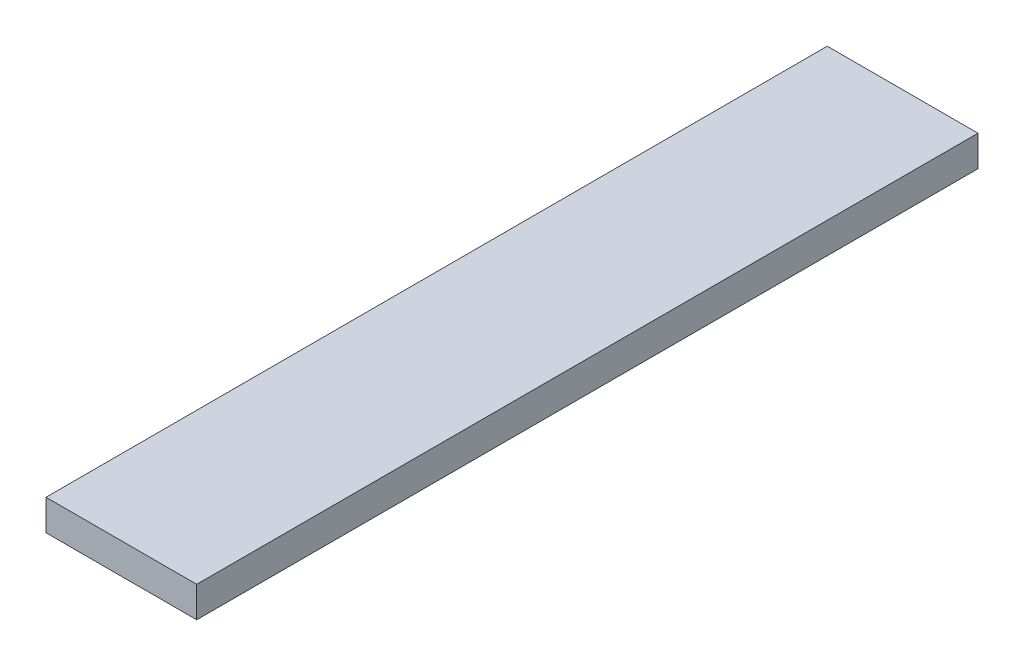
ISO-10303-21;
HEADER;
FILE_DESCRIPTION(('STEP AP214'),'2;1');
FILE_NAME('part.step','',(''),(''),'','','');
FILE_SCHEMA(('AUTOMOTIVE_DESIGN { 1 0 10303 214 1 1 1 1 }'));
ENDSEC;
DATA;
#1=APPLICATION_CONTEXT('core data for automotive mechanical design processes');
#2=APPLICATION_PROTOCOL_DEFINITION('international standard','automotive_design',2000,#1);
#3=PRODUCT_CONTEXT('',#1,'mechanical');
#4=PRODUCT('Part','Part','',(#3));
#5=PRODUCT_RELATED_PRODUCT_CATEGORY('part','',(#4));
#6=PRODUCT_DEFINITION_FORMATION('','',#4);
#7=PRODUCT_DEFINITION_CONTEXT('part definition',#1,'design');
#8=PRODUCT_DEFINITION('design','',#6,#7);
#9=PRODUCT_DEFINITION_SHAPE('','',#8);
#10=(LENGTH_UNIT() NAMED_UNIT(*) SI_UNIT(.MILLI.,.METRE.));
#11=(NAMED_UNIT(*) PLANE_ANGLE_UNIT() SI_UNIT($,.RADIAN.));
#12=(NAMED_UNIT(*) SI_UNIT($,.STERADIAN.) SOLID_ANGLE_UNIT());
#13=UNCERTAINTY_MEASURE_WITH_UNIT(LENGTH_MEASURE(1.E-05),#10,'distance_accuracy_value','');
#14=(GEOMETRIC_REPRESENTATION_CONTEXT(3) GLOBAL_UNCERTAINTY_ASSIGNED_CONTEXT((#13)) GLOBAL_UNIT_ASSIGNED_CONTEXT((#10,
#11,#12)) REPRESENTATION_CONTEXT('',''));
#15=CARTESIAN_POINT('',(0.,0.,0.));
#16=DIRECTION('',(0.,0.,1.));
#17=DIRECTION('',(1.,0.,0.));
#18=AXIS2_PLACEMENT_3D('',#15,#16,#17);
#19=CARTESIAN_POINT('',(4.9,2.,-25.4));
#20=DIRECTION('',(-1.,0.,0.));
#21=DIRECTION('',(0.,0.,1.));
#22=AXIS2_PLACEMENT_3D('',#19,#20,#21);
#23=PLANE('',#22);
#24=DIRECTION('',(0.,0.,-1.));
#25=VECTOR('',#24,1.);
#26=CARTESIAN_POINT('',(4.9,0.,-25.4));
#27=LINE('',#26,#25);
#28=CARTESIAN_POINT('',(4.9,0.,25.4));
#29=VERTEX_POINT('',#28);
#30=CARTESIAN_POINT('',(4.9,0.,-25.4));
#31=VERTEX_POINT('',#30);
#32=EDGE_CURVE('E104',#29,#31,#27,.T.);
#33=ORIENTED_EDGE('',*,*,#32,.T.);
#34=DIRECTION('',(0.,-1.,0.));
#35=VECTOR('',#34,1.);
#36=CARTESIAN_POINT('',(4.9,2.,-25.4));
#37=LINE('',#36,#35);
#38=CARTESIAN_POINT('',(4.9,2.,-25.4));
#39=VERTEX_POINT('',#38);
#40=EDGE_CURVE('E11',#39,#31,#37,.T.);
#41=ORIENTED_EDGE('',*,*,#40,.F.);
#42=DIRECTION('',(0.,0.,-1.));
#43=VECTOR('',#42,1.);
#44=CARTESIAN_POINT('',(4.9,2.,-25.4));
#45=LINE('',#44,#43);
#46=CARTESIAN_POINT('',(4.9,2.,25.4));
#47=VERTEX_POINT('',#46);
#48=EDGE_CURVE('E92',#47,#39,#45,.T.);
#49=ORIENTED_EDGE('',*,*,#48,.F.);
#50=DIRECTION('',(0.,-1.,0.));
#51=VECTOR('',#50,1.);
#52=CARTESIAN_POINT('',(4.9,2.,25.4));
#53=LINE('',#52,#51);
#54=EDGE_CURVE('E100',#47,#29,#53,.T.);
#55=ORIENTED_EDGE('',*,*,#54,.T.);
#56=EDGE_LOOP('',(#33,#41,#49,#55));
#57=FACE_BOUND('',#56,.T.);
#58=ADVANCED_FACE('F41',(#57),#23,.F.);
#59=CARTESIAN_POINT('',(-4.9,2.,-25.4));
#60=DIRECTION('',(0.,0.,1.));
#61=DIRECTION('',(1.,0.,0.));
#62=AXIS2_PLACEMENT_3D('',#59,#60,#61);
#63=PLANE('',#62);
#64=DIRECTION('',(-1.,0.,0.));
#65=VECTOR('',#64,1.);
#66=CARTESIAN_POINT('',(-4.9,0.,-25.4));
#67=LINE('',#66,#65);
#68=CARTESIAN_POINT('',(-4.9,0.,-25.4));
#69=VERTEX_POINT('',#68);
#70=EDGE_CURVE('E96',#31,#69,#67,.T.);
#71=ORIENTED_EDGE('',*,*,#70,.T.);
#72=DIRECTION('',(0.,-1.,0.));
#73=VECTOR('',#72,1.);
#74=CARTESIAN_POINT('',(-4.9,2.,-25.4));
#75=LINE('',#74,#73);
#76=CARTESIAN_POINT('',(-4.9,2.,-25.4));
#77=VERTEX_POINT('',#76);
#78=EDGE_CURVE('E49',#77,#69,#75,.T.);
#79=ORIENTED_EDGE('',*,*,#78,.F.);
#80=DIRECTION('',(-1.,0.,0.));
#81=VECTOR('',#80,1.);
#82=CARTESIAN_POINT('',(-4.9,2.,-25.4));
#83=LINE('',#82,#81);
#84=EDGE_CURVE('E87',#39,#77,#83,.T.);
#85=ORIENTED_EDGE('',*,*,#84,.F.);
#86=ORIENTED_EDGE('',*,*,#40,.T.);
#87=EDGE_LOOP('',(#71,#79,#85,#86));
#88=FACE_BOUND('',#87,.T.);
#89=ADVANCED_FACE('F95',(#88),#63,.F.);
#90=CARTESIAN_POINT('',(-4.9,2.,-25.4));
#91=DIRECTION('',(1.,0.,0.));
#92=DIRECTION('',(0.,0.,-1.));
#93=AXIS2_PLACEMENT_3D('',#90,#91,#92);
#94=PLANE('',#93);
#95=DIRECTION('',(0.,0.,1.));
#96=VECTOR('',#95,1.);
#97=CARTESIAN_POINT('',(-4.9,0.,-25.4));
#98=LINE('',#97,#96);
#99=CARTESIAN_POINT('',(-4.9,0.,25.4));
#100=VERTEX_POINT('',#99);
#101=EDGE_CURVE('E74',#69,#100,#98,.T.);
#102=ORIENTED_EDGE('',*,*,#101,.T.);
#103=DIRECTION('',(0.,-1.,0.));
#104=VECTOR('',#103,1.);
#105=CARTESIAN_POINT('',(-4.9,2.,25.4));
#106=LINE('',#105,#104);
#107=CARTESIAN_POINT('',(-4.9,2.,25.4));
#108=VERTEX_POINT('',#107);
#109=EDGE_CURVE('E97',#108,#100,#106,.T.);
#110=ORIENTED_EDGE('',*,*,#109,.F.);
#111=DIRECTION('',(0.,0.,1.));
#112=VECTOR('',#111,1.);
#113=CARTESIAN_POINT('',(-4.9,2.,-25.4));
#114=LINE('',#113,#112);
#115=EDGE_CURVE('E90',#77,#108,#114,.T.);
#116=ORIENTED_EDGE('',*,*,#115,.F.);
#117=ORIENTED_EDGE('',*,*,#78,.T.);
#118=EDGE_LOOP('',(#102,#110,#116,#117));
#119=FACE_BOUND('',#118,.T.);
#120=ADVANCED_FACE('F98',(#119),#94,.F.);
#121=CARTESIAN_POINT('',(-4.9,2.,25.4));
#122=DIRECTION('',(0.,0.,-1.));
#123=DIRECTION('',(-1.,0.,0.));
#124=AXIS2_PLACEMENT_3D('',#121,#122,#123);
#125=PLANE('',#124);
#126=DIRECTION('',(1.,0.,0.));
#127=VECTOR('',#126,1.);
#128=CARTESIAN_POINT('',(-4.9,0.,25.4));
#129=LINE('',#128,#127);
#130=EDGE_CURVE('E80',#100,#29,#129,.T.);
#131=ORIENTED_EDGE('',*,*,#130,.T.);
#132=ORIENTED_EDGE('',*,*,#54,.F.);
#133=DIRECTION('',(1.,0.,0.));
#134=VECTOR('',#133,1.);
#135=CARTESIAN_POINT('',(-4.9,2.,25.4));
#136=LINE('',#135,#134);
#137=EDGE_CURVE('E57',#108,#47,#136,.T.);
#138=ORIENTED_EDGE('',*,*,#137,.F.);
#139=ORIENTED_EDGE('',*,*,#109,.T.);
#140=EDGE_LOOP('',(#131,#132,#138,#139));
#141=FACE_BOUND('',#140,.T.);
#142=ADVANCED_FACE('F111',(#141),#125,.F.);
#143=CARTESIAN_POINT('',(0.,2.,0.));
#144=DIRECTION('',(0.,1.,0.));
#145=DIRECTION('',(0.,0.,1.));
#146=AXIS2_PLACEMENT_3D('',#143,#144,#145);
#147=PLANE('',#146);
#148=ORIENTED_EDGE('',*,*,#48,.T.);
#149=ORIENTED_EDGE('',*,*,#84,.T.);
#150=ORIENTED_EDGE('',*,*,#115,.T.);
#151=ORIENTED_EDGE('',*,*,#137,.T.);
#152=EDGE_LOOP('',(#148,#149,#150,#151));
#153=FACE_BOUND('',#152,.T.);
#154=ADVANCED_FACE('F88',(#153),#147,.T.);
#155=CARTESIAN_POINT('',(0.,0.,0.));
#156=DIRECTION('',(0.,1.,0.));
#157=DIRECTION('',(0.,0.,1.));
#158=AXIS2_PLACEMENT_3D('',#155,#156,#157);
#159=PLANE('',#158);
#160=ORIENTED_EDGE('',*,*,#32,.F.);
#161=ORIENTED_EDGE('',*,*,#130,.F.);
#162=ORIENTED_EDGE('',*,*,#101,.F.);
#163=ORIENTED_EDGE('',*,*,#70,.F.);
#164=EDGE_LOOP('',(#160,#161,#162,#163));
#165=FACE_BOUND('',#164,.T.);
#166=ADVANCED_FACE('F114',(#165),#159,.F.);
#167=CLOSED_SHELL('',(#58,#89,#120,#142,#154,#166));
#168=MANIFOLD_SOLID_BREP('B2',#167);
#169=ADVANCED_BREP_SHAPE_REPRESENTATION('',(#18,#168),#14);
#170=SHAPE_DEFINITION_REPRESENTATION(#9,#169);
ENDSEC;
END-ISO-10303-21;
